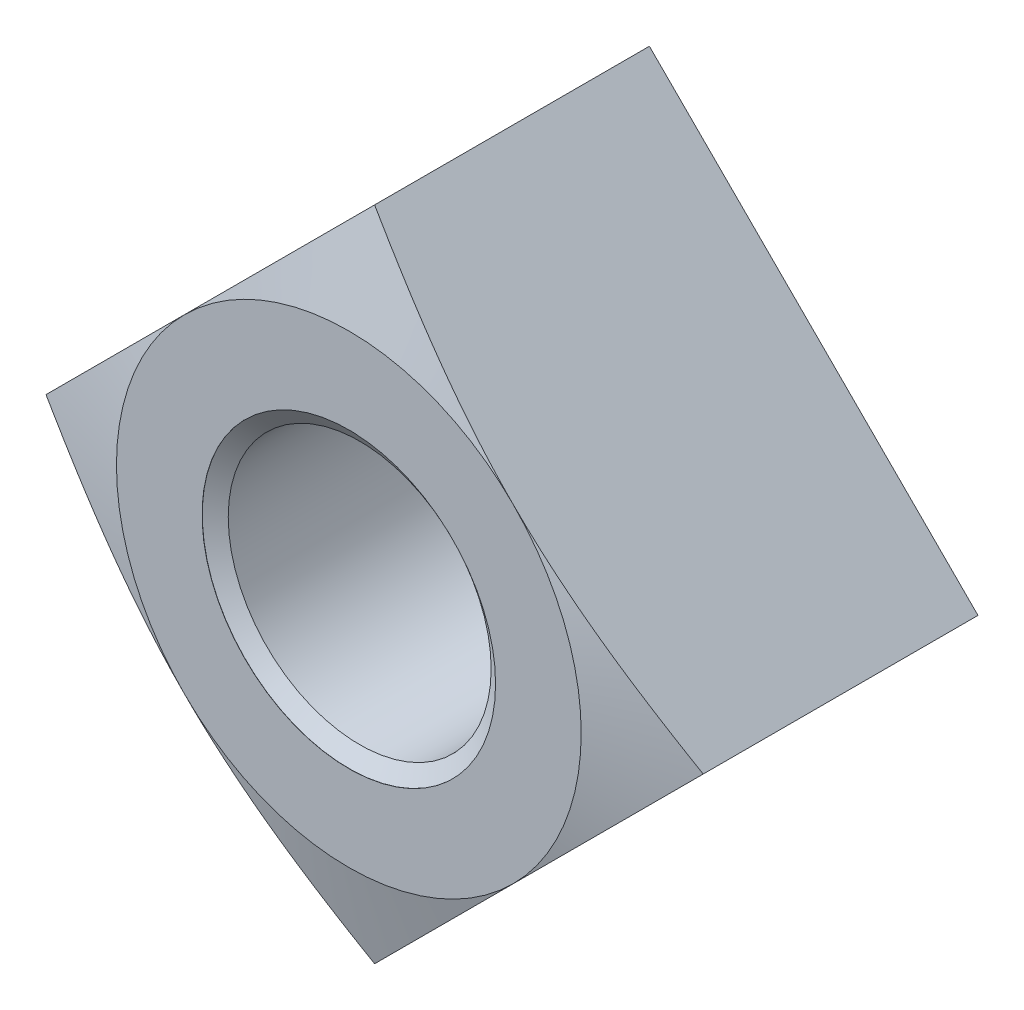
ISO-10303-21;
HEADER;
FILE_DESCRIPTION(('STEP AP214'),'2;1');
FILE_NAME('part.step','',(''),(''),'','','');
FILE_SCHEMA(('AUTOMOTIVE_DESIGN { 1 0 10303 214 1 1 1 1 }'));
ENDSEC;
DATA;
#1=APPLICATION_CONTEXT('core data for automotive mechanical design processes');
#2=APPLICATION_PROTOCOL_DEFINITION('international standard','automotive_design',2000,#1);
#3=PRODUCT_CONTEXT('',#1,'mechanical');
#4=PRODUCT('Part','Part','',(#3));
#5=PRODUCT_RELATED_PRODUCT_CATEGORY('part','',(#4));
#6=PRODUCT_DEFINITION_FORMATION('','',#4);
#7=PRODUCT_DEFINITION_CONTEXT('part definition',#1,'design');
#8=PRODUCT_DEFINITION('design','',#6,#7);
#9=PRODUCT_DEFINITION_SHAPE('','',#8);
#10=(LENGTH_UNIT() NAMED_UNIT(*) SI_UNIT(.MILLI.,.METRE.));
#11=(NAMED_UNIT(*) PLANE_ANGLE_UNIT() SI_UNIT($,.RADIAN.));
#12=(NAMED_UNIT(*) SI_UNIT($,.STERADIAN.) SOLID_ANGLE_UNIT());
#13=UNCERTAINTY_MEASURE_WITH_UNIT(LENGTH_MEASURE(1.E-05),#10,'distance_accuracy_value','');
#14=(GEOMETRIC_REPRESENTATION_CONTEXT(3) GLOBAL_UNCERTAINTY_ASSIGNED_CONTEXT((#13)) GLOBAL_UNIT_ASSIGNED_CONTEXT((#10,
#11,#12)) REPRESENTATION_CONTEXT('',''));
#15=CARTESIAN_POINT('',(0.,0.,0.));
#16=DIRECTION('',(0.,0.,1.));
#17=DIRECTION('',(1.,0.,0.));
#18=AXIS2_PLACEMENT_3D('',#15,#16,#17);
#19=CARTESIAN_POINT('',(0.,-42.6562165750785,-39.0144));
#20=DIRECTION('',(0.707106781186548,-0.707106781186547,0.));
#21=DIRECTION('',(0.707106781186547,0.707106781186548,0.));
#22=AXIS2_PLACEMENT_3D('',#19,#20,#21);
#23=PLANE('',#22);
#24=DIRECTION('',(0.,0.,1.));
#25=VECTOR('',#24,1.);
#26=CARTESIAN_POINT('',(42.6562165750785,0.,-39.0144));
#27=LINE('',#26,#25);
#28=CARTESIAN_POINT('',(42.6562165750785,0.,-39.0144));
#29=VERTEX_POINT('',#28);
#30=CARTESIAN_POINT('',(42.6562165750785,0.,-3.34768126675557));
#31=VERTEX_POINT('',#30);
#32=EDGE_CURVE('E168',#29,#31,#27,.T.);
#33=ORIENTED_EDGE('',*,*,#32,.T.);
#34=CARTESIAN_POINT('',(42.6564165750785,0.000200000000002282,-3.34773485671969));
#35=CARTESIAN_POINT('',(42.0162838174509,-0.639932757627605,-3.17624094799073));
#36=CARTESIAN_POINT('',(41.3756504855724,-1.28056608950606,-3.0084153798943));
#37=CARTESIAN_POINT('',(40.0932585239618,-2.5629580511167,-2.68135794378593));
#38=CARTESIAN_POINT('',(39.4514998431311,-3.20471673194735,-2.52212647701492));
#39=CARTESIAN_POINT('',(38.1663703273046,-4.48984624777383,-2.21342903181921));
#40=CARTESIAN_POINT('',(37.5229987096781,-5.13321786540039,-2.06396954402222));
#41=CARTESIAN_POINT('',(36.2349895477649,-6.42122702731354,-1.77641893627764));
#42=CARTESIAN_POINT('',(35.5903520178302,-7.06586455724824,-1.6383276881994));
#43=CARTESIAN_POINT('',(34.2990241235247,-8.35719245155376,-1.3750056122677));
#44=CARTESIAN_POINT('',(33.6523322705082,-9.00388430457027,-1.24978932044012));
#45=CARTESIAN_POINT('',(32.3575832920351,-10.2986332830434,-1.01417781204615));
#46=CARTESIAN_POINT('',(31.7095261465085,-10.94669042857,-0.90378281492196));
#47=CARTESIAN_POINT('',(30.4122133429642,-12.2440032321143,-0.699696491860565));
#48=CARTESIAN_POINT('',(29.7629579327243,-12.8932586423542,-0.606002034707239));
#49=CARTESIAN_POINT('',(28.4632570240165,-14.192959551062,-0.437132099569779));
#50=CARTESIAN_POINT('',(27.81281156546,-14.8434050096185,-0.361956011591227));
#51=CARTESIAN_POINT('',(26.5207414750492,-16.1354751000293,-0.232781497135903));
#52=CARTESIAN_POINT('',(25.87913208945,-16.7770844856285,-0.178480197276098));
#53=CARTESIAN_POINT('',(24.5951950872223,-18.0610214878562,-0.0907703634707877));
#54=CARTESIAN_POINT('',(23.9528674721941,-18.7033491028844,-0.0573617830681815));
#55=CARTESIAN_POINT('',(22.6678183302311,-19.9883982448474,-0.012299329327398));
#56=CARTESIAN_POINT('',(22.0250967977915,-20.631119777287,-0.00064576727239103));
#57=CARTESIAN_POINT('',(20.739643776005,-21.9165727990735,0.000593454709909664));
#58=CARTESIAN_POINT('',(20.0969122866715,-22.559304288407,-0.0098208577583249));
#59=CARTESIAN_POINT('',(18.8124636851975,-23.843752889881,-0.0524163726672703));
#60=CARTESIAN_POINT('',(18.1707462045826,-24.4854703704959,-0.0845755496241365));
#61=CARTESIAN_POINT('',(16.8880073255374,-25.7682092495411,-0.169807584089167));
#62=CARTESIAN_POINT('',(16.246985931865,-26.4092306432135,-0.222880583656635));
#63=CARTESIAN_POINT('',(14.9659220888409,-27.6902944862376,-0.348660368509645));
#64=CARTESIAN_POINT('',(14.3258796283155,-28.330336946763,-0.421366927985331));
#65=CARTESIAN_POINT('',(13.046947865708,-29.6092687093705,-0.584830770854349));
#66=CARTESIAN_POINT('',(12.4080585761605,-30.248157998918,-0.675588249275258));
#67=CARTESIAN_POINT('',(11.2779328737127,-31.3782837013658,-0.850724372539919));
#68=CARTESIAN_POINT('',(10.7864374293796,-31.8697791456989,-0.931792352751777));
#69=CARTESIAN_POINT('',(9.80425820269431,-32.8519583723842,-1.10279583099567));
#70=CARTESIAN_POINT('',(9.31357436355036,-33.3426422115281,-1.1927306793502));
#71=CARTESIAN_POINT('',(7.84255937103827,-34.8136572040402,-1.47465846003344));
#72=CARTESIAN_POINT('',(6.86337977995311,-35.7928367951254,-1.67875642338029));
#73=CARTESIAN_POINT('',(5.39372069710386,-37.2624958779746,-2.00536713018552));
#74=CARTESIAN_POINT('',(4.90212381618959,-37.7540927588889,-2.1180386268546));
#75=CARTESIAN_POINT('',(3.91963685047365,-38.7365797246048,-2.34939897510869));
#76=CARTESIAN_POINT('',(3.4287467643275,-39.227469810751,-2.46808781523179));
#77=CARTESIAN_POINT('',(2.44781617048722,-40.2084004045913,-2.71081913897835));
#78=CARTESIAN_POINT('',(1.95777541785273,-40.6984411572258,-2.8348596500163));
#79=CARTESIAN_POINT('',(0.978325997158257,-41.6778905779202,-3.08779288553859));
#80=CARTESIAN_POINT('',(0.48891732164625,-42.1672992534322,-3.21668555226705));
#81=CARTESIAN_POINT('',(-0.000200000000005291,-42.6564165750785,-3.34773485671969));
#82=B_SPLINE_CURVE_WITH_KNOTS('',3,(#34,#35,#36,#37,#38,#39,#40,#41,#42,#43,#44,#45,#46,#47,#48,
#49,#50,#51,#52,#53,#54,#55,#56,#57,#58,#59,#60,#61,#62,#63,#64,#65,#66,#67,#68,#69,#70,#71,#72,
#73,#74,#75,#76,#77,#78,#79,#80,#81),.UNSPECIFIED.,.F.,.F.,(4,2,2,2,2,2,2,2,2,2,2,2,2,2,2,2,2,2,
2,2,2,2,2,4),(0.,2.7641660407986,5.52846102338471,8.29457380215429,11.0606553999863,
13.8298264256308,16.5990384467469,19.3677307156178,22.1363317716655,24.8630930377956,
27.5898482406712,30.3166424592115,33.0434332668356,35.7674662234906,38.4915176837404,
41.2155378154145,43.9395873798235,46.0389010869981,48.1380610911166,52.3368720806113,
54.4497374410451,56.5625987770168,58.6746878726021,60.7867518356445),.UNSPECIFIED.);
#83=CARTESIAN_POINT('',(21.3281082875392,-21.3281082875392,0.));
#84=VERTEX_POINT('',#83);
#85=EDGE_CURVE('E55',#31,#84,#82,.T.);
#86=ORIENTED_EDGE('',*,*,#85,.T.);
#87=CARTESIAN_POINT('',(0.,-42.6562165750785,-3.34768126675557));
#88=VERTEX_POINT('',#87);
#89=EDGE_CURVE('E137',#84,#88,#82,.T.);
#90=ORIENTED_EDGE('',*,*,#89,.T.);
#91=DIRECTION('',(0.,0.,1.));
#92=VECTOR('',#91,1.);
#93=CARTESIAN_POINT('',(0.,-42.6562165750785,-39.0144));
#94=LINE('',#93,#92);
#95=CARTESIAN_POINT('',(0.,-42.6562165750785,-39.0144));
#96=VERTEX_POINT('',#95);
#97=EDGE_CURVE('E169',#96,#88,#94,.T.);
#98=ORIENTED_EDGE('',*,*,#97,.F.);
#99=DIRECTION('',(0.707106781186547,0.707106781186548,0.));
#100=VECTOR('',#99,1.);
#101=CARTESIAN_POINT('',(0.,-42.6562165750785,-39.0144));
#102=LINE('',#101,#100);
#103=EDGE_CURVE('E157',#96,#29,#102,.T.);
#104=ORIENTED_EDGE('',*,*,#103,.T.);
#105=EDGE_LOOP('',(#33,#86,#90,#98,#104));
#106=FACE_BOUND('',#105,.T.);
#107=ADVANCED_FACE('F32',(#106),#23,.T.);
#108=CARTESIAN_POINT('',(-42.6562165750785,0.,-39.0144));
#109=DIRECTION('',(-0.707106781186548,-0.707106781186547,0.));
#110=DIRECTION('',(0.707106781186547,-0.707106781186548,0.));
#111=AXIS2_PLACEMENT_3D('',#108,#109,#110);
#112=PLANE('',#111);
#113=ORIENTED_EDGE('',*,*,#97,.T.);
#114=CARTESIAN_POINT('',(0.000199999999994679,-42.6564165750785,-3.34773485671969));
#115=CARTESIAN_POINT('',(-0.639932757627618,-42.0162838174509,-3.17624094799074));
#116=CARTESIAN_POINT('',(-1.28056608950607,-41.3756504855724,-3.0084153798943));
#117=CARTESIAN_POINT('',(-2.56295805111671,-40.0932585239618,-2.68135794378594));
#118=CARTESIAN_POINT('',(-3.20471673194736,-39.4514998431311,-2.52212647701493));
#119=CARTESIAN_POINT('',(-4.48984624777384,-38.1663703273047,-2.21342903181922));
#120=CARTESIAN_POINT('',(-5.1332178654004,-37.5229987096781,-2.06396954402222));
#121=CARTESIAN_POINT('',(-6.42122702731355,-36.234989547765,-1.77641893627764));
#122=CARTESIAN_POINT('',(-7.06586455724826,-35.5903520178302,-1.63832768819941));
#123=CARTESIAN_POINT('',(-8.35719245155377,-34.2990241235247,-1.3750056122677));
#124=CARTESIAN_POINT('',(-9.00388430457028,-33.6523322705082,-1.24978932044012));
#125=CARTESIAN_POINT('',(-10.2986332830434,-32.3575832920351,-1.01417781204616));
#126=CARTESIAN_POINT('',(-10.94669042857,-31.7095261465085,-0.903782814921965));
#127=CARTESIAN_POINT('',(-12.2440032321143,-30.4122133429642,-0.69969649186057));
#128=CARTESIAN_POINT('',(-12.8932586423542,-29.7629579327243,-0.606002034707243));
#129=CARTESIAN_POINT('',(-14.192959551062,-28.4632570240165,-0.437132099569782));
#130=CARTESIAN_POINT('',(-14.8434050096185,-27.81281156546,-0.361956011591229));
#131=CARTESIAN_POINT('',(-16.1354751000293,-26.5207414750492,-0.232781497135905));
#132=CARTESIAN_POINT('',(-16.7770844856285,-25.87913208945,-0.178480197276101));
#133=CARTESIAN_POINT('',(-18.0610214878562,-24.5951950872223,-0.0907703634707908));
#134=CARTESIAN_POINT('',(-18.7033491028844,-23.9528674721941,-0.0573617830681846));
#135=CARTESIAN_POINT('',(-19.9883982448474,-22.6678183302311,-0.0122993293274005));
#136=CARTESIAN_POINT('',(-20.631119777287,-22.0250967977915,-0.000645767272392995));
#137=CARTESIAN_POINT('',(-21.9165727990735,-20.739643776005,0.00059345470990791));
#138=CARTESIAN_POINT('',(-22.559304288407,-20.0969122866715,-0.00982085775832694));
#139=CARTESIAN_POINT('',(-23.843752889881,-18.8124636851975,-0.0524163726672729));
#140=CARTESIAN_POINT('',(-24.4854703704959,-18.1707462045826,-0.0845755496241392));
#141=CARTESIAN_POINT('',(-25.7682092495411,-16.8880073255374,-0.169807584089169));
#142=CARTESIAN_POINT('',(-26.4092306432135,-16.246985931865,-0.222880583656637));
#143=CARTESIAN_POINT('',(-27.6902944862376,-14.9659220888409,-0.348660368509646));
#144=CARTESIAN_POINT('',(-28.330336946763,-14.3258796283155,-0.421366927985333));
#145=CARTESIAN_POINT('',(-29.6092687093705,-13.046947865708,-0.584830770854352));
#146=CARTESIAN_POINT('',(-30.248157998918,-12.4080585761605,-0.675588249275262));
#147=CARTESIAN_POINT('',(-31.3782837013658,-11.2779328737127,-0.850724372539921));
#148=CARTESIAN_POINT('',(-31.8697791456989,-10.7864374293796,-0.931792352751779));
#149=CARTESIAN_POINT('',(-32.8519583723842,-9.8042582026943,-1.10279583099567));
#150=CARTESIAN_POINT('',(-33.3426422115281,-9.31357436355034,-1.1927306793502));
#151=CARTESIAN_POINT('',(-34.8136572040402,-7.84255937103826,-1.47465846003344));
#152=CARTESIAN_POINT('',(-35.7928367951254,-6.8633797799531,-1.67875642338029));
#153=CARTESIAN_POINT('',(-37.2624958779746,-5.39372069710385,-2.00536713018552));
#154=CARTESIAN_POINT('',(-37.7540927588889,-4.90212381618959,-2.11803862685459));
#155=CARTESIAN_POINT('',(-38.7365797246048,-3.91963685047365,-2.34939897510869));
#156=CARTESIAN_POINT('',(-39.227469810751,-3.42874676432749,-2.46808781523179));
#157=CARTESIAN_POINT('',(-40.2084004045913,-2.44781617048722,-2.71081913897835));
#158=CARTESIAN_POINT('',(-40.6984411572258,-1.95777541785273,-2.8348596500163));
#159=CARTESIAN_POINT('',(-41.6778905779202,-0.978325997158258,-3.08779288553858));
#160=CARTESIAN_POINT('',(-42.1672992534322,-0.488917321646251,-3.21668555226704));
#161=CARTESIAN_POINT('',(-42.6564165750785,0.000200000000005433,-3.34773485671969));
#162=B_SPLINE_CURVE_WITH_KNOTS('',3,(#114,#115,#116,#117,#118,#119,#120,#121,#122,#123,#124,
#125,#126,#127,#128,#129,#130,#131,#132,#133,#134,#135,#136,#137,#138,#139,#140,#141,#142,#143,
#144,#145,#146,#147,#148,#149,#150,#151,#152,#153,#154,#155,#156,#157,#158,#159,#160,#161),
.UNSPECIFIED.,.F.,.F.,(4,2,2,2,2,2,2,2,2,2,2,2,2,2,2,2,2,2,2,2,2,2,2,4),(0.,2.7641660407986,
5.52846102338471,8.2945738021543,11.0606553999863,13.8298264256308,16.5990384467469,
19.3677307156179,22.1363317716655,24.8630930377956,27.5898482406713,30.3166424592115,
33.0434332668356,35.7674662234906,38.4915176837404,41.2155378154145,43.9395873798236,
46.0389010869982,48.1380610911166,52.3368720806113,54.4497374410451,56.5625987770168,
58.6746878726021,60.7867518356445),.UNSPECIFIED.);
#163=CARTESIAN_POINT('',(-21.3281082875392,-21.3281082875392,0.));
#164=VERTEX_POINT('',#163);
#165=EDGE_CURVE('E111',#88,#164,#162,.T.);
#166=ORIENTED_EDGE('',*,*,#165,.T.);
#167=CARTESIAN_POINT('',(-42.6562165750785,0.,-3.34768126675557));
#168=VERTEX_POINT('',#167);
#169=EDGE_CURVE('E98',#164,#168,#162,.T.);
#170=ORIENTED_EDGE('',*,*,#169,.T.);
#171=DIRECTION('',(0.,0.,1.));
#172=VECTOR('',#171,1.);
#173=CARTESIAN_POINT('',(-42.6562165750785,0.,-39.0144));
#174=LINE('',#173,#172);
#175=CARTESIAN_POINT('',(-42.6562165750785,0.,-39.0144));
#176=VERTEX_POINT('',#175);
#177=EDGE_CURVE('E110',#176,#168,#174,.T.);
#178=ORIENTED_EDGE('',*,*,#177,.F.);
#179=DIRECTION('',(0.707106781186547,-0.707106781186548,0.));
#180=VECTOR('',#179,1.);
#181=CARTESIAN_POINT('',(-42.6562165750785,0.,-39.0144));
#182=LINE('',#181,#180);
#183=EDGE_CURVE('E165',#176,#96,#182,.T.);
#184=ORIENTED_EDGE('',*,*,#183,.T.);
#185=EDGE_LOOP('',(#113,#166,#170,#178,#184));
#186=FACE_BOUND('',#185,.T.);
#187=ADVANCED_FACE('F200',(#186),#112,.T.);
#188=CARTESIAN_POINT('',(0.,42.6562165750785,-39.0144));
#189=DIRECTION('',(-0.707106781186548,0.707106781186548,0.));
#190=DIRECTION('',(-0.707106781186548,-0.707106781186548,0.));
#191=AXIS2_PLACEMENT_3D('',#188,#189,#190);
#192=PLANE('',#191);
#193=ORIENTED_EDGE('',*,*,#177,.T.);
#194=CARTESIAN_POINT('',(-42.6564165750785,-0.000199999999992443,-3.34773485671969));
#195=CARTESIAN_POINT('',(-42.0162838174509,0.639932757627621,-3.17624094799073));
#196=CARTESIAN_POINT('',(-41.3756504855724,1.28056608950607,-3.0084153798943));
#197=CARTESIAN_POINT('',(-40.0932585239618,2.56295805111671,-2.68135794378594));
#198=CARTESIAN_POINT('',(-39.4514998431311,3.20471673194736,-2.52212647701492));
#199=CARTESIAN_POINT('',(-38.1663703273046,4.48984624777384,-2.21342903181922));
#200=CARTESIAN_POINT('',(-37.5229987096781,5.13321786540041,-2.06396954402222));
#201=CARTESIAN_POINT('',(-36.2349895477649,6.42122702731356,-1.77641893627764));
#202=CARTESIAN_POINT('',(-35.5903520178302,7.06586455724826,-1.6383276881994));
#203=CARTESIAN_POINT('',(-34.2990241235247,8.35719245155378,-1.3750056122677));
#204=CARTESIAN_POINT('',(-33.6523322705082,9.00388430457028,-1.24978932044012));
#205=CARTESIAN_POINT('',(-32.3575832920351,10.2986332830434,-1.01417781204616));
#206=CARTESIAN_POINT('',(-31.7095261465085,10.94669042857,-0.903782814921961));
#207=CARTESIAN_POINT('',(-30.4122133429642,12.2440032321143,-0.699696491860567));
#208=CARTESIAN_POINT('',(-29.7629579327243,12.8932586423542,-0.606002034707241));
#209=CARTESIAN_POINT('',(-28.4632570240165,14.192959551062,-0.437132099569781));
#210=CARTESIAN_POINT('',(-27.81281156546,14.8434050096185,-0.361956011591229));
#211=CARTESIAN_POINT('',(-26.5207414750492,16.1354751000293,-0.232781497135905));
#212=CARTESIAN_POINT('',(-25.87913208945,16.7770844856285,-0.1784801972761));
#213=CARTESIAN_POINT('',(-24.5951950872223,18.0610214878562,-0.0907703634707895));
#214=CARTESIAN_POINT('',(-23.9528674721941,18.7033491028844,-0.0573617830681835));
#215=CARTESIAN_POINT('',(-22.6678183302311,19.9883982448474,-0.0122993293273998));
#216=CARTESIAN_POINT('',(-22.0250967977915,20.631119777287,-0.000645767272392476));
#217=CARTESIAN_POINT('',(-20.739643776005,21.9165727990735,0.00059345470990832));
#218=CARTESIAN_POINT('',(-20.0969122866715,22.559304288407,-0.00982085775832647));
#219=CARTESIAN_POINT('',(-18.8124636851975,23.843752889881,-0.0524163726672726));
#220=CARTESIAN_POINT('',(-18.1707462045826,24.4854703704959,-0.0845755496241392));
#221=CARTESIAN_POINT('',(-16.8880073255374,25.7682092495411,-0.169807584089169));
#222=CARTESIAN_POINT('',(-16.246985931865,26.4092306432135,-0.222880583656637));
#223=CARTESIAN_POINT('',(-14.9659220888409,27.6902944862376,-0.348660368509646));
#224=CARTESIAN_POINT('',(-14.3258796283155,28.330336946763,-0.421366927985333));
#225=CARTESIAN_POINT('',(-13.046947865708,29.6092687093705,-0.584830770854351));
#226=CARTESIAN_POINT('',(-12.4080585761605,30.248157998918,-0.67558824927526));
#227=CARTESIAN_POINT('',(-11.2779328737127,31.3782837013658,-0.850724372539921));
#228=CARTESIAN_POINT('',(-10.7864374293796,31.8697791456989,-0.931792352751779));
#229=CARTESIAN_POINT('',(-9.80425820269431,32.8519583723842,-1.10279583099567));
#230=CARTESIAN_POINT('',(-9.31357436355036,33.3426422115281,-1.1927306793502));
#231=CARTESIAN_POINT('',(-7.84255937103827,34.8136572040402,-1.47465846003344));
#232=CARTESIAN_POINT('',(-6.86337977995312,35.7928367951254,-1.6787564233803));
#233=CARTESIAN_POINT('',(-5.39372069710387,37.2624958779746,-2.00536713018552));
#234=CARTESIAN_POINT('',(-4.90212381618961,37.7540927588889,-2.1180386268546));
#235=CARTESIAN_POINT('',(-3.91963685047367,38.7365797246048,-2.34939897510869));
#236=CARTESIAN_POINT('',(-3.42874676432751,39.227469810751,-2.46808781523179));
#237=CARTESIAN_POINT('',(-2.44781617048723,40.2084004045913,-2.71081913897835));
#238=CARTESIAN_POINT('',(-1.95777541785274,40.6984411572258,-2.8348596500163));
#239=CARTESIAN_POINT('',(-0.97832599715827,41.6778905779202,-3.08779288553858));
#240=CARTESIAN_POINT('',(-0.488917321646262,42.1672992534322,-3.21668555226704));
#241=CARTESIAN_POINT('',(0.000199999999996414,42.6564165750785,-3.34773485671969));
#242=B_SPLINE_CURVE_WITH_KNOTS('',3,(#194,#195,#196,#197,#198,#199,#200,#201,#202,#203,#204,
#205,#206,#207,#208,#209,#210,#211,#212,#213,#214,#215,#216,#217,#218,#219,#220,#221,#222,#223,
#224,#225,#226,#227,#228,#229,#230,#231,#232,#233,#234,#235,#236,#237,#238,#239,#240,#241),
.UNSPECIFIED.,.F.,.F.,(4,2,2,2,2,2,2,2,2,2,2,2,2,2,2,2,2,2,2,2,2,2,2,4),(0.,2.7641660407986,
5.52846102338471,8.2945738021543,11.0606553999863,13.8298264256308,16.5990384467469,
19.3677307156179,22.1363317716655,24.8630930377956,27.5898482406713,30.3166424592115,
33.0434332668356,35.7674662234906,38.4915176837404,41.2155378154145,43.9395873798235,
46.0389010869981,48.1380610911166,52.3368720806112,54.4497374410451,56.5625987770168,
58.6746878726021,60.7867518356444),.UNSPECIFIED.);
#243=CARTESIAN_POINT('',(-21.3281082875392,21.3281082875392,0.));
#244=VERTEX_POINT('',#243);
#245=EDGE_CURVE('E93',#168,#244,#242,.T.);
#246=ORIENTED_EDGE('',*,*,#245,.T.);
#247=CARTESIAN_POINT('',(0.,42.6562165750785,-3.34768126675557));
#248=VERTEX_POINT('',#247);
#249=EDGE_CURVE('E85',#244,#248,#242,.T.);
#250=ORIENTED_EDGE('',*,*,#249,.T.);
#251=DIRECTION('',(0.,0.,1.));
#252=VECTOR('',#251,1.);
#253=CARTESIAN_POINT('',(0.,42.6562165750785,-39.0144));
#254=LINE('',#253,#252);
#255=CARTESIAN_POINT('',(0.,42.6562165750785,-39.0144));
#256=VERTEX_POINT('',#255);
#257=EDGE_CURVE('E173',#256,#248,#254,.T.);
#258=ORIENTED_EDGE('',*,*,#257,.F.);
#259=DIRECTION('',(-0.707106781186548,-0.707106781186548,0.));
#260=VECTOR('',#259,1.);
#261=CARTESIAN_POINT('',(0.,42.6562165750785,-39.0144));
#262=LINE('',#261,#260);
#263=EDGE_CURVE('E163',#256,#176,#262,.T.);
#264=ORIENTED_EDGE('',*,*,#263,.T.);
#265=EDGE_LOOP('',(#193,#246,#250,#258,#264));
#266=FACE_BOUND('',#265,.T.);
#267=ADVANCED_FACE('F108',(#266),#192,.T.);
#268=CARTESIAN_POINT('',(42.6562165750785,0.,-39.0144));
#269=DIRECTION('',(0.707106781186548,0.707106781186548,0.));
#270=DIRECTION('',(-0.707106781186548,0.707106781186548,0.));
#271=AXIS2_PLACEMENT_3D('',#268,#269,#270);
#272=PLANE('',#271);
#273=ORIENTED_EDGE('',*,*,#257,.T.);
#274=CARTESIAN_POINT('',(-0.000200000000001697,42.6564165750785,-3.34773485671969));
#275=CARTESIAN_POINT('',(0.639932757627611,42.0162838174509,-3.17624094799073));
#276=CARTESIAN_POINT('',(1.28056608950607,41.3756504855724,-3.0084153798943));
#277=CARTESIAN_POINT('',(2.56295805111671,40.0932585239618,-2.68135794378594));
#278=CARTESIAN_POINT('',(3.20471673194735,39.4514998431311,-2.52212647701492));
#279=CARTESIAN_POINT('',(4.48984624777383,38.1663703273046,-2.21342903181922));
#280=CARTESIAN_POINT('',(5.1332178654004,37.5229987096781,-2.06396954402222));
#281=CARTESIAN_POINT('',(6.42122702731355,36.2349895477649,-1.77641893627764));
#282=CARTESIAN_POINT('',(7.06586455724825,35.5903520178302,-1.63832768819941));
#283=CARTESIAN_POINT('',(8.35719245155377,34.2990241235247,-1.3750056122677));
#284=CARTESIAN_POINT('',(9.00388430457028,33.6523322705082,-1.24978932044012));
#285=CARTESIAN_POINT('',(10.2986332830434,32.3575832920351,-1.01417781204616));
#286=CARTESIAN_POINT('',(10.94669042857,31.7095261465085,-0.903782814921961));
#287=CARTESIAN_POINT('',(12.2440032321143,30.4122133429642,-0.699696491860566));
#288=CARTESIAN_POINT('',(12.8932586423542,29.7629579327243,-0.606002034707241));
#289=CARTESIAN_POINT('',(14.192959551062,28.4632570240165,-0.437132099569781));
#290=CARTESIAN_POINT('',(14.8434050096185,27.81281156546,-0.361956011591229));
#291=CARTESIAN_POINT('',(16.1354751000293,26.5207414750492,-0.232781497135904));
#292=CARTESIAN_POINT('',(16.7770844856285,25.87913208945,-0.178480197276099));
#293=CARTESIAN_POINT('',(18.0610214878562,24.5951950872223,-0.0907703634707889));
#294=CARTESIAN_POINT('',(18.7033491028844,23.9528674721941,-0.0573617830681833));
#295=CARTESIAN_POINT('',(19.9883982448474,22.6678183302311,-0.0122993293274));
#296=CARTESIAN_POINT('',(20.631119777287,22.0250967977915,-0.000645767272392478));
#297=CARTESIAN_POINT('',(21.9165727990735,20.739643776005,0.000593454709908323));
#298=CARTESIAN_POINT('',(22.559304288407,20.0969122866715,-0.00982085775832666));
#299=CARTESIAN_POINT('',(23.843752889881,18.8124636851975,-0.0524163726672723));
#300=CARTESIAN_POINT('',(24.4854703704959,18.1707462045826,-0.0845755496241382));
#301=CARTESIAN_POINT('',(25.7682092495411,16.8880073255374,-0.169807584089168));
#302=CARTESIAN_POINT('',(26.4092306432135,16.246985931865,-0.222880583656637));
#303=CARTESIAN_POINT('',(27.6902944862376,14.9659220888409,-0.348660368509646));
#304=CARTESIAN_POINT('',(28.330336946763,14.3258796283155,-0.421366927985332));
#305=CARTESIAN_POINT('',(29.6092687093705,13.046947865708,-0.58483077085435));
#306=CARTESIAN_POINT('',(30.248157998918,12.4080585761605,-0.675588249275261));
#307=CARTESIAN_POINT('',(31.3782837013658,11.2779328737127,-0.850724372539921));
#308=CARTESIAN_POINT('',(31.8697791456989,10.7864374293796,-0.931792352751778));
#309=CARTESIAN_POINT('',(32.8519583723842,9.80425820269432,-1.10279583099567));
#310=CARTESIAN_POINT('',(33.3426422115281,9.31357436355036,-1.1927306793502));
#311=CARTESIAN_POINT('',(34.8136572040402,7.84255937103828,-1.47465846003344));
#312=CARTESIAN_POINT('',(35.7928367951254,6.86337977995312,-1.67875642338029));
#313=CARTESIAN_POINT('',(37.2624958779746,5.39372069710387,-2.00536713018552));
#314=CARTESIAN_POINT('',(37.7540927588889,4.90212381618961,-2.11803862685459));
#315=CARTESIAN_POINT('',(38.7365797246048,3.91963685047367,-2.34939897510869));
#316=CARTESIAN_POINT('',(39.227469810751,3.42874676432752,-2.46808781523179));
#317=CARTESIAN_POINT('',(40.2084004045912,2.44781617048724,-2.71081913897835));
#318=CARTESIAN_POINT('',(40.6984411572257,1.95777541785275,-2.83485965001629));
#319=CARTESIAN_POINT('',(41.6778905779202,0.978325997158278,-3.08779288553858));
#320=CARTESIAN_POINT('',(42.1672992534322,0.488917321646267,-3.21668555226704));
#321=CARTESIAN_POINT('',(42.6564165750785,-0.000199999999992435,-3.34773485671969));
#322=B_SPLINE_CURVE_WITH_KNOTS('',3,(#274,#275,#276,#277,#278,#279,#280,#281,#282,#283,#284,
#285,#286,#287,#288,#289,#290,#291,#292,#293,#294,#295,#296,#297,#298,#299,#300,#301,#302,#303,
#304,#305,#306,#307,#308,#309,#310,#311,#312,#313,#314,#315,#316,#317,#318,#319,#320,#321),
.UNSPECIFIED.,.F.,.F.,(4,2,2,2,2,2,2,2,2,2,2,2,2,2,2,2,2,2,2,2,2,2,2,4),(0.,2.7641660407986,
5.52846102338471,8.2945738021543,11.0606553999863,13.8298264256308,16.5990384467469,
19.3677307156179,22.1363317716655,24.8630930377956,27.5898482406713,30.3166424592115,
33.0434332668356,35.7674662234906,38.4915176837404,41.2155378154145,43.9395873798235,
46.0389010869981,48.1380610911166,52.3368720806112,54.4497374410451,56.5625987770168,
58.6746878726021,60.7867518356444),.UNSPECIFIED.);
#323=CARTESIAN_POINT('',(21.3281082875392,21.3281082875392,0.));
#324=VERTEX_POINT('',#323);
#325=EDGE_CURVE('E89',#248,#324,#322,.T.);
#326=ORIENTED_EDGE('',*,*,#325,.T.);
#327=EDGE_CURVE('E105',#324,#31,#322,.T.);
#328=ORIENTED_EDGE('',*,*,#327,.T.);
#329=ORIENTED_EDGE('',*,*,#32,.F.);
#330=DIRECTION('',(-0.707106781186548,0.707106781186548,0.));
#331=VECTOR('',#330,1.);
#332=CARTESIAN_POINT('',(42.6562165750785,0.,-39.0144));
#333=LINE('',#332,#331);
#334=EDGE_CURVE('E160',#29,#256,#333,.T.);
#335=ORIENTED_EDGE('',*,*,#334,.T.);
#336=EDGE_LOOP('',(#273,#326,#328,#329,#335));
#337=FACE_BOUND('',#336,.T.);
#338=ADVANCED_FACE('F194',(#337),#272,.T.);
#339=CARTESIAN_POINT('',(42.6562165750785,0.,0.));
#340=DIRECTION('',(0.,0.,1.));
#341=DIRECTION('',(1.,0.,0.));
#342=AXIS2_PLACEMENT_3D('',#339,#340,#341);
#343=PLANE('',#342);
#344=CARTESIAN_POINT('',(0.,0.,0.));
#345=DIRECTION('',(0.,0.,1.));
#346=DIRECTION('',(1.,0.,0.));
#347=AXIS2_PLACEMENT_3D('',#344,#345,#346);
#348=CIRCLE('',#347,19.05);
#349=CARTESIAN_POINT('',(19.05,0.,0.));
#350=VERTEX_POINT('',#349);
#351=EDGE_CURVE('E150',#350,#350,#348,.T.);
#352=ORIENTED_EDGE('',*,*,#351,.F.);
#353=EDGE_LOOP('',(#352));
#354=FACE_BOUND('',#353,.T.);
#355=CARTESIAN_POINT('',(0.,0.,0.));
#356=DIRECTION('',(0.,0.,1.));
#357=DIRECTION('',(1.,0.,0.));
#358=AXIS2_PLACEMENT_3D('',#355,#356,#357);
#359=CIRCLE('',#358,30.1625);
#360=EDGE_CURVE('E36',#84,#324,#359,.T.);
#361=ORIENTED_EDGE('',*,*,#360,.T.);
#362=CARTESIAN_POINT('',(0.,0.,0.));
#363=DIRECTION('',(0.,0.,1.));
#364=DIRECTION('',(1.,0.,0.));
#365=AXIS2_PLACEMENT_3D('',#362,#363,#364);
#366=CIRCLE('',#365,30.1625);
#367=EDGE_CURVE('E48',#324,#244,#366,.T.);
#368=ORIENTED_EDGE('',*,*,#367,.T.);
#369=EDGE_CURVE('E11',#244,#164,#359,.T.);
#370=ORIENTED_EDGE('',*,*,#369,.T.);
#371=EDGE_CURVE('E41',#164,#84,#359,.T.);
#372=ORIENTED_EDGE('',*,*,#371,.T.);
#373=EDGE_LOOP('',(#361,#368,#370,#372));
#374=FACE_BOUND('',#373,.T.);
#375=ADVANCED_FACE('F104',(#354,#374),#343,.T.);
#376=CARTESIAN_POINT('',(0.,0.,-39.0144));
#377=DIRECTION('',(0.,0.,1.));
#378=DIRECTION('',(1.,0.,0.));
#379=AXIS2_PLACEMENT_3D('',#376,#377,#378);
#380=CYLINDRICAL_SURFACE('',#379,17.06626);
#381=CARTESIAN_POINT('',(0.,0.,-1.41137378464202));
#382=DIRECTION('',(0.,0.,1.));
#383=DIRECTION('',(1.,0.,0.));
#384=AXIS2_PLACEMENT_3D('',#381,#382,#383);
#385=CIRCLE('',#384,17.06626);
#386=CARTESIAN_POINT('',(17.06626,0.,-1.41137378464202));
#387=VERTEX_POINT('',#386);
#388=EDGE_CURVE('E156',#387,#387,#385,.F.);
#389=ORIENTED_EDGE('',*,*,#388,.F.);
#390=EDGE_LOOP('',(#389));
#391=FACE_BOUND('',#390,.T.);
#392=CARTESIAN_POINT('',(0.,0.,-37.603026215358));
#393=DIRECTION('',(0.,0.,-1.));
#394=DIRECTION('',(-1.,0.,0.));
#395=AXIS2_PLACEMENT_3D('',#392,#393,#394);
#396=CIRCLE('',#395,17.06626);
#397=CARTESIAN_POINT('',(-17.06626,0.,-37.603026215358));
#398=VERTEX_POINT('',#397);
#399=EDGE_CURVE('E149',#398,#398,#396,.F.);
#400=ORIENTED_EDGE('',*,*,#399,.F.);
#401=EDGE_LOOP('',(#400));
#402=FACE_BOUND('',#401,.T.);
#403=ADVANCED_FACE('F182',(#391,#402),#380,.F.);
#404=CARTESIAN_POINT('',(42.6562165750785,0.,-39.0144));
#405=DIRECTION('',(0.,0.,1.));
#406=DIRECTION('',(1.,0.,0.));
#407=AXIS2_PLACEMENT_3D('',#404,#405,#406);
#408=PLANE('',#407);
#409=CARTESIAN_POINT('',(0.,0.,-39.0144));
#410=DIRECTION('',(0.,0.,1.));
#411=DIRECTION('',(1.,0.,0.));
#412=AXIS2_PLACEMENT_3D('',#409,#410,#411);
#413=CIRCLE('',#412,19.05);
#414=CARTESIAN_POINT('',(19.05,0.,-39.0144));
#415=VERTEX_POINT('',#414);
#416=EDGE_CURVE('E146',#415,#415,#413,.T.);
#417=ORIENTED_EDGE('',*,*,#416,.T.);
#418=EDGE_LOOP('',(#417));
#419=FACE_BOUND('',#418,.T.);
#420=ORIENTED_EDGE('',*,*,#103,.F.);
#421=ORIENTED_EDGE('',*,*,#183,.F.);
#422=ORIENTED_EDGE('',*,*,#263,.F.);
#423=ORIENTED_EDGE('',*,*,#334,.F.);
#424=EDGE_LOOP('',(#420,#421,#422,#423));
#425=FACE_BOUND('',#424,.T.);
#426=ADVANCED_FACE('F184',(#419,#425),#408,.F.);
#427=CARTESIAN_POINT('',(0.,0.,-1.55022516310622));
#428=DIRECTION('',(0.,0.,1.));
#429=DIRECTION('',(1.,0.,0.));
#430=AXIS2_PLACEMENT_3D('',#427,#428,#429);
#431=CONICAL_SURFACE('',#430,16.867886,0.960105621522076);
#432=CARTESIAN_POINT('',(0.,0.,-0.0228599999999995));
#433=DIRECTION('',(0.,0.,1.));
#434=DIRECTION('',(1.,0.,0.));
#435=AXIS2_PLACEMENT_3D('',#432,#433,#434);
#436=CIRCLE('',#435,19.05);
#437=CARTESIAN_POINT('',(19.05,0.,-0.0228599999999995));
#438=VERTEX_POINT('',#437);
#439=EDGE_CURVE('E153',#438,#438,#436,.T.);
#440=ORIENTED_EDGE('',*,*,#439,.T.);
#441=EDGE_LOOP('',(#440));
#442=FACE_BOUND('',#441,.T.);
#443=ORIENTED_EDGE('',*,*,#388,.T.);
#444=EDGE_LOOP('',(#443));
#445=FACE_BOUND('',#444,.T.);
#446=ADVANCED_FACE('F191',(#442,#445),#431,.F.);
#447=CARTESIAN_POINT('',(0.,0.,-25.0375057290932));
#448=DIRECTION('',(0.,0.,1.));
#449=DIRECTION('',(1.,0.,0.));
#450=AXIS2_PLACEMENT_3D('',#447,#448,#449);
#451=CYLINDRICAL_SURFACE('',#450,19.05);
#452=ORIENTED_EDGE('',*,*,#351,.T.);
#453=EDGE_LOOP('',(#452));
#454=FACE_BOUND('',#453,.T.);
#455=ORIENTED_EDGE('',*,*,#439,.F.);
#456=EDGE_LOOP('',(#455));
#457=FACE_BOUND('',#456,.T.);
#458=ADVANCED_FACE('F224',(#454,#457),#451,.F.);
#459=CARTESIAN_POINT('',(0.,0.,-38.99154));
#460=DIRECTION('',(0.,0.,-1.));
#461=DIRECTION('',(-1.,0.,0.));
#462=AXIS2_PLACEMENT_3D('',#459,#460,#461);
#463=CONICAL_SURFACE('',#462,19.05,0.960105621522078);
#464=CARTESIAN_POINT('',(0.,0.,-38.99154));
#465=DIRECTION('',(0.,0.,1.));
#466=DIRECTION('',(1.,0.,0.));
#467=AXIS2_PLACEMENT_3D('',#464,#465,#466);
#468=CIRCLE('',#467,19.05);
#469=CARTESIAN_POINT('',(19.05,0.,-38.99154));
#470=VERTEX_POINT('',#469);
#471=EDGE_CURVE('E143',#470,#470,#468,.T.);
#472=ORIENTED_EDGE('',*,*,#471,.F.);
#473=EDGE_LOOP('',(#472));
#474=FACE_BOUND('',#473,.T.);
#475=ORIENTED_EDGE('',*,*,#399,.T.);
#476=EDGE_LOOP('',(#475));
#477=FACE_BOUND('',#476,.T.);
#478=ADVANCED_FACE('F132',(#474,#477),#463,.F.);
#479=CARTESIAN_POINT('',(0.,0.,-25.0375057290932));
#480=DIRECTION('',(0.,0.,1.));
#481=DIRECTION('',(1.,0.,0.));
#482=AXIS2_PLACEMENT_3D('',#479,#480,#481);
#483=CYLINDRICAL_SURFACE('',#482,19.05);
#484=ORIENTED_EDGE('',*,*,#471,.T.);
#485=EDGE_LOOP('',(#484));
#486=FACE_BOUND('',#485,.T.);
#487=ORIENTED_EDGE('',*,*,#416,.F.);
#488=EDGE_LOOP('',(#487));
#489=FACE_BOUND('',#488,.T.);
#490=ADVANCED_FACE('F215',(#486,#489),#483,.F.);
#491=CARTESIAN_POINT('',(0.,0.,0.));
#492=DIRECTION('',(0.,0.,-1.));
#493=DIRECTION('',(-1.,0.,0.));
#494=AXIS2_PLACEMENT_3D('',#491,#492,#493);
#495=CONICAL_SURFACE('',#494,30.1625,1.30899693899575);
#496=ORIENTED_EDGE('',*,*,#327,.F.);
#497=ORIENTED_EDGE('',*,*,#360,.F.);
#498=ORIENTED_EDGE('',*,*,#85,.F.);
#499=EDGE_LOOP('',(#496,#497,#498));
#500=FACE_BOUND('',#499,.T.);
#501=ADVANCED_FACE('F131',(#500),#495,.T.);
#502=ORIENTED_EDGE('',*,*,#371,.F.);
#503=ORIENTED_EDGE('',*,*,#165,.F.);
#504=ORIENTED_EDGE('',*,*,#89,.F.);
#505=EDGE_LOOP('',(#502,#503,#504));
#506=FACE_BOUND('',#505,.T.);
#507=ADVANCED_FACE('F213',(#506),#495,.T.);
#508=ORIENTED_EDGE('',*,*,#369,.F.);
#509=ORIENTED_EDGE('',*,*,#245,.F.);
#510=ORIENTED_EDGE('',*,*,#169,.F.);
#511=EDGE_LOOP('',(#508,#509,#510));
#512=FACE_BOUND('',#511,.T.);
#513=ADVANCED_FACE('F96',(#512),#495,.T.);
#514=ORIENTED_EDGE('',*,*,#367,.F.);
#515=ORIENTED_EDGE('',*,*,#325,.F.);
#516=ORIENTED_EDGE('',*,*,#249,.F.);
#517=EDGE_LOOP('',(#514,#515,#516));
#518=FACE_BOUND('',#517,.T.);
#519=ADVANCED_FACE('F87',(#518),#495,.T.);
#520=CLOSED_SHELL('',(#107,#187,#267,#338,#375,#403,#426,#446,#458,#478,#490,#501,#507,#513,#519));
#521=MANIFOLD_SOLID_BREP('B2',#520);
#522=ADVANCED_BREP_SHAPE_REPRESENTATION('',(#18,#521),#14);
#523=SHAPE_DEFINITION_REPRESENTATION(#9,#522);
ENDSEC;
END-ISO-10303-21;
